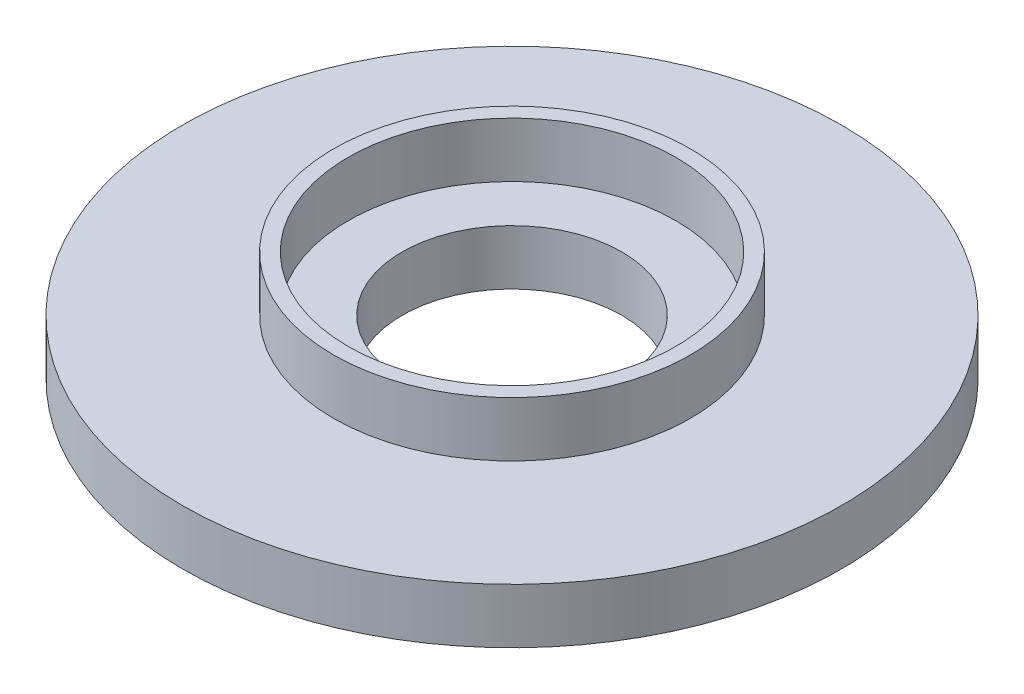
ISO-10303-21;
HEADER;
FILE_DESCRIPTION(('STEP AP214'),'2;1');
FILE_NAME('part.step','',(''),(''),'','','');
FILE_SCHEMA(('AUTOMOTIVE_DESIGN { 1 0 10303 214 1 1 1 1 }'));
ENDSEC;
DATA;
#1=APPLICATION_CONTEXT('core data for automotive mechanical design processes');
#2=APPLICATION_PROTOCOL_DEFINITION('international standard','automotive_design',2000,#1);
#3=PRODUCT_CONTEXT('',#1,'mechanical');
#4=PRODUCT('Part','Part','',(#3));
#5=PRODUCT_RELATED_PRODUCT_CATEGORY('part','',(#4));
#6=PRODUCT_DEFINITION_FORMATION('','',#4);
#7=PRODUCT_DEFINITION_CONTEXT('part definition',#1,'design');
#8=PRODUCT_DEFINITION('design','',#6,#7);
#9=PRODUCT_DEFINITION_SHAPE('','',#8);
#10=(LENGTH_UNIT() NAMED_UNIT(*) SI_UNIT(.MILLI.,.METRE.));
#11=(NAMED_UNIT(*) PLANE_ANGLE_UNIT() SI_UNIT($,.RADIAN.));
#12=(NAMED_UNIT(*) SI_UNIT($,.STERADIAN.) SOLID_ANGLE_UNIT());
#13=UNCERTAINTY_MEASURE_WITH_UNIT(LENGTH_MEASURE(1.E-05),#10,'distance_accuracy_value','');
#14=(GEOMETRIC_REPRESENTATION_CONTEXT(3) GLOBAL_UNCERTAINTY_ASSIGNED_CONTEXT((#13)) GLOBAL_UNIT_ASSIGNED_CONTEXT((#10,
#11,#12)) REPRESENTATION_CONTEXT('',''));
#15=CARTESIAN_POINT('',(0.,0.,0.));
#16=DIRECTION('',(0.,0.,1.));
#17=DIRECTION('',(1.,0.,0.));
#18=AXIS2_PLACEMENT_3D('',#15,#16,#17);
#19=CARTESIAN_POINT('',(0.,3.,0.));
#20=DIRECTION('',(0.,1.,0.));
#21=DIRECTION('',(0.,0.,1.));
#22=AXIS2_PLACEMENT_3D('',#19,#20,#21);
#23=PLANE('',#22);
#24=CARTESIAN_POINT('',(0.,3.,0.));
#25=DIRECTION('',(0.,1.,0.));
#26=DIRECTION('',(0.,0.,1.));
#27=AXIS2_PLACEMENT_3D('',#24,#25,#26);
#28=CIRCLE('',#27,6.);
#29=CARTESIAN_POINT('',(0.,3.,6.));
#30=VERTEX_POINT('',#29);
#31=EDGE_CURVE('E47',#30,#30,#28,.T.);
#32=ORIENTED_EDGE('',*,*,#31,.F.);
#33=EDGE_LOOP('',(#32));
#34=FACE_BOUND('',#33,.T.);
#35=CARTESIAN_POINT('',(0.,3.,0.));
#36=DIRECTION('',(0.,1.,0.));
#37=DIRECTION('',(0.,0.,1.));
#38=AXIS2_PLACEMENT_3D('',#35,#36,#37);
#39=CIRCLE('',#38,8.95);
#40=CARTESIAN_POINT('',(0.,3.,8.95));
#41=VERTEX_POINT('',#40);
#42=EDGE_CURVE('E10',#41,#41,#39,.F.);
#43=ORIENTED_EDGE('',*,*,#42,.F.);
#44=EDGE_LOOP('',(#43));
#45=FACE_BOUND('',#44,.T.);
#46=ADVANCED_FACE('F31',(#34,#45),#23,.T.);
#47=CARTESIAN_POINT('',(0.,3.,0.));
#48=DIRECTION('',(0.,1.,0.));
#49=DIRECTION('',(0.,0.,1.));
#50=AXIS2_PLACEMENT_3D('',#47,#48,#49);
#51=CIRCLE('',#50,9.75);
#52=CARTESIAN_POINT('',(0.,3.,9.75));
#53=VERTEX_POINT('',#52);
#54=EDGE_CURVE('E55',#53,#53,#51,.T.);
#55=ORIENTED_EDGE('',*,*,#54,.F.);
#56=EDGE_LOOP('',(#55));
#57=FACE_BOUND('',#56,.T.);
#58=CARTESIAN_POINT('',(0.,3.,0.));
#59=DIRECTION('',(0.,1.,0.));
#60=DIRECTION('',(0.,0.,1.));
#61=AXIS2_PLACEMENT_3D('',#58,#59,#60);
#62=CIRCLE('',#61,18.);
#63=CARTESIAN_POINT('',(0.,3.,18.));
#64=VERTEX_POINT('',#63);
#65=EDGE_CURVE('E38',#64,#64,#62,.T.);
#66=ORIENTED_EDGE('',*,*,#65,.T.);
#67=EDGE_LOOP('',(#66));
#68=FACE_BOUND('',#67,.T.);
#69=ADVANCED_FACE('F82',(#57,#68),#23,.T.);
#70=CARTESIAN_POINT('',(0.,0.,0.));
#71=DIRECTION('',(0.,1.,0.));
#72=DIRECTION('',(0.,0.,1.));
#73=AXIS2_PLACEMENT_3D('',#70,#71,#72);
#74=PLANE('',#73);
#75=CARTESIAN_POINT('',(0.,0.,0.));
#76=DIRECTION('',(0.,1.,0.));
#77=DIRECTION('',(0.,0.,1.));
#78=AXIS2_PLACEMENT_3D('',#75,#76,#77);
#79=CIRCLE('',#78,18.);
#80=CARTESIAN_POINT('',(0.,0.,18.));
#81=VERTEX_POINT('',#80);
#82=EDGE_CURVE('E42',#81,#81,#79,.T.);
#83=ORIENTED_EDGE('',*,*,#82,.F.);
#84=EDGE_LOOP('',(#83));
#85=FACE_BOUND('',#84,.T.);
#86=CARTESIAN_POINT('',(0.,0.,0.));
#87=DIRECTION('',(0.,1.,0.));
#88=DIRECTION('',(0.,0.,1.));
#89=AXIS2_PLACEMENT_3D('',#86,#87,#88);
#90=CIRCLE('',#89,6.);
#91=CARTESIAN_POINT('',(0.,0.,6.));
#92=VERTEX_POINT('',#91);
#93=EDGE_CURVE('E49',#92,#92,#90,.T.);
#94=ORIENTED_EDGE('',*,*,#93,.T.);
#95=EDGE_LOOP('',(#94));
#96=FACE_BOUND('',#95,.T.);
#97=ADVANCED_FACE('F88',(#85,#96),#74,.F.);
#98=CARTESIAN_POINT('',(0.,3.,0.));
#99=DIRECTION('',(0.,-1.,0.));
#100=DIRECTION('',(0.,0.,-1.));
#101=AXIS2_PLACEMENT_3D('',#98,#99,#100);
#102=CYLINDRICAL_SURFACE('',#101,18.);
#103=ORIENTED_EDGE('',*,*,#65,.F.);
#104=EDGE_LOOP('',(#103));
#105=FACE_BOUND('',#104,.T.);
#106=ORIENTED_EDGE('',*,*,#82,.T.);
#107=EDGE_LOOP('',(#106));
#108=FACE_BOUND('',#107,.T.);
#109=ADVANCED_FACE('F33',(#105,#108),#102,.T.);
#110=CARTESIAN_POINT('',(0.,3.,0.));
#111=DIRECTION('',(0.,-1.,0.));
#112=DIRECTION('',(0.,0.,-1.));
#113=AXIS2_PLACEMENT_3D('',#110,#111,#112);
#114=CYLINDRICAL_SURFACE('',#113,6.);
#115=ORIENTED_EDGE('',*,*,#31,.T.);
#116=EDGE_LOOP('',(#115));
#117=FACE_BOUND('',#116,.T.);
#118=ORIENTED_EDGE('',*,*,#93,.F.);
#119=EDGE_LOOP('',(#118));
#120=FACE_BOUND('',#119,.T.);
#121=ADVANCED_FACE('F69',(#117,#120),#114,.F.);
#122=CARTESIAN_POINT('',(0.,6.,0.));
#123=DIRECTION('',(0.,1.,0.));
#124=DIRECTION('',(0.,0.,1.));
#125=AXIS2_PLACEMENT_3D('',#122,#123,#124);
#126=PLANE('',#125);
#127=CARTESIAN_POINT('',(0.,6.,0.));
#128=DIRECTION('',(0.,1.,0.));
#129=DIRECTION('',(0.,0.,1.));
#130=AXIS2_PLACEMENT_3D('',#127,#128,#129);
#131=CIRCLE('',#130,9.75);
#132=CARTESIAN_POINT('',(0.,6.,9.75));
#133=VERTEX_POINT('',#132);
#134=EDGE_CURVE('E52',#133,#133,#131,.T.);
#135=ORIENTED_EDGE('',*,*,#134,.T.);
#136=EDGE_LOOP('',(#135));
#137=FACE_BOUND('',#136,.T.);
#138=CARTESIAN_POINT('',(0.,6.,0.));
#139=DIRECTION('',(0.,1.,0.));
#140=DIRECTION('',(0.,0.,1.));
#141=AXIS2_PLACEMENT_3D('',#138,#139,#140);
#142=CIRCLE('',#141,8.95);
#143=CARTESIAN_POINT('',(0.,6.,8.95));
#144=VERTEX_POINT('',#143);
#145=EDGE_CURVE('E58',#144,#144,#142,.T.);
#146=ORIENTED_EDGE('',*,*,#145,.F.);
#147=EDGE_LOOP('',(#146));
#148=FACE_BOUND('',#147,.T.);
#149=ADVANCED_FACE('F66',(#137,#148),#126,.T.);
#150=CARTESIAN_POINT('',(0.,6.,0.));
#151=DIRECTION('',(0.,-1.,0.));
#152=DIRECTION('',(0.,0.,-1.));
#153=AXIS2_PLACEMENT_3D('',#150,#151,#152);
#154=CYLINDRICAL_SURFACE('',#153,9.75);
#155=ORIENTED_EDGE('',*,*,#134,.F.);
#156=EDGE_LOOP('',(#155));
#157=FACE_BOUND('',#156,.T.);
#158=ORIENTED_EDGE('',*,*,#54,.T.);
#159=EDGE_LOOP('',(#158));
#160=FACE_BOUND('',#159,.T.);
#161=ADVANCED_FACE('F68',(#157,#160),#154,.T.);
#162=CARTESIAN_POINT('',(0.,6.,0.));
#163=DIRECTION('',(0.,-1.,0.));
#164=DIRECTION('',(0.,0.,-1.));
#165=AXIS2_PLACEMENT_3D('',#162,#163,#164);
#166=CYLINDRICAL_SURFACE('',#165,8.95);
#167=ORIENTED_EDGE('',*,*,#145,.T.);
#168=EDGE_LOOP('',(#167));
#169=FACE_BOUND('',#168,.T.);
#170=ORIENTED_EDGE('',*,*,#42,.T.);
#171=EDGE_LOOP('',(#170));
#172=FACE_BOUND('',#171,.T.);
#173=ADVANCED_FACE('F64',(#169,#172),#166,.F.);
#174=CLOSED_SHELL('',(#46,#69,#97,#109,#121,#149,#161,#173));
#175=MANIFOLD_SOLID_BREP('B2',#174);
#176=ADVANCED_BREP_SHAPE_REPRESENTATION('',(#18,#175),#14);
#177=SHAPE_DEFINITION_REPRESENTATION(#9,#176);
ENDSEC;
END-ISO-10303-21;
